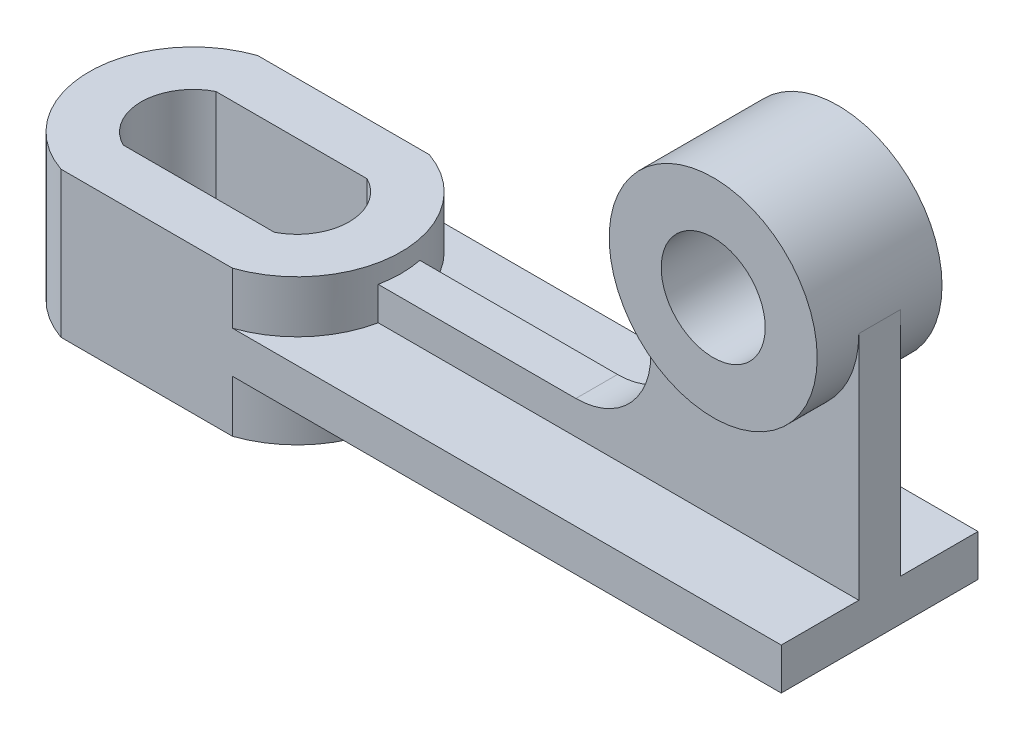
ISO-10303-21;
HEADER;
FILE_DESCRIPTION(('STEP AP214'),'2;1');
FILE_NAME('part.step','',(''),(''),'','','');
FILE_SCHEMA(('AUTOMOTIVE_DESIGN { 1 0 10303 214 1 1 1 1 }'));
ENDSEC;
DATA;
#1=APPLICATION_CONTEXT('core data for automotive mechanical design processes');
#2=APPLICATION_PROTOCOL_DEFINITION('international standard','automotive_design',2000,#1);
#3=PRODUCT_CONTEXT('',#1,'mechanical');
#4=PRODUCT('Part','Part','',(#3));
#5=PRODUCT_RELATED_PRODUCT_CATEGORY('part','',(#4));
#6=PRODUCT_DEFINITION_FORMATION('','',#4);
#7=PRODUCT_DEFINITION_CONTEXT('part definition',#1,'design');
#8=PRODUCT_DEFINITION('design','',#6,#7);
#9=PRODUCT_DEFINITION_SHAPE('','',#8);
#10=(LENGTH_UNIT() NAMED_UNIT(*) SI_UNIT(.MILLI.,.METRE.));
#11=(NAMED_UNIT(*) PLANE_ANGLE_UNIT() SI_UNIT($,.RADIAN.));
#12=(NAMED_UNIT(*) SI_UNIT($,.STERADIAN.) SOLID_ANGLE_UNIT());
#13=UNCERTAINTY_MEASURE_WITH_UNIT(LENGTH_MEASURE(1.E-05),#10,'distance_accuracy_value','');
#14=(GEOMETRIC_REPRESENTATION_CONTEXT(3) GLOBAL_UNCERTAINTY_ASSIGNED_CONTEXT((#13)) GLOBAL_UNIT_ASSIGNED_CONTEXT((#10,
#11,#12)) REPRESENTATION_CONTEXT('',''));
#15=CARTESIAN_POINT('',(0.,0.,0.));
#16=DIRECTION('',(0.,0.,1.));
#17=DIRECTION('',(1.,0.,0.));
#18=AXIS2_PLACEMENT_3D('',#15,#16,#17);
#19=CARTESIAN_POINT('',(152.5,5.,23.6421649826217));
#20=DIRECTION('',(0.,-1.,0.));
#21=DIRECTION('',(0.,0.,-1.));
#22=AXIS2_PLACEMENT_3D('',#19,#20,#21);
#23=PLANE('',#22);
#24=CARTESIAN_POINT('',(12.5,5.,0.));
#25=DIRECTION('',(0.,-1.,0.));
#26=DIRECTION('',(0.,0.,-1.));
#27=AXIS2_PLACEMENT_3D('',#24,#25,#26);
#28=CIRCLE('',#27,25.);
#29=CARTESIAN_POINT('',(20.6269942127762,5.,-23.6421649826217));
#30=VERTEX_POINT('',#29);
#31=CARTESIAN_POINT('',(36.9948974278318,5.,-5.));
#32=VERTEX_POINT('',#31);
#33=EDGE_CURVE('E254',#30,#32,#28,.T.);
#34=ORIENTED_EDGE('',*,*,#33,.T.);
#35=DIRECTION('',(-1.,0.,0.));
#36=VECTOR('',#35,1.);
#37=CARTESIAN_POINT('',(152.5,5.,-5.));
#38=LINE('',#37,#36);
#39=CARTESIAN_POINT('',(152.5,5.,-4.99999999999999));
#40=VERTEX_POINT('',#39);
#41=EDGE_CURVE('E182',#40,#32,#38,.T.);
#42=ORIENTED_EDGE('',*,*,#41,.F.);
#43=DIRECTION('',(0.,0.,1.));
#44=VECTOR('',#43,1.);
#45=CARTESIAN_POINT('',(152.5,5.,23.6421649826217));
#46=LINE('',#45,#44);
#47=CARTESIAN_POINT('',(152.5,5.,-23.6421649826217));
#48=VERTEX_POINT('',#47);
#49=EDGE_CURVE('E224',#48,#40,#46,.T.);
#50=ORIENTED_EDGE('',*,*,#49,.F.);
#51=DIRECTION('',(-1.,0.,0.));
#52=VECTOR('',#51,1.);
#53=CARTESIAN_POINT('',(152.5,5.,-23.6421649826217));
#54=LINE('',#53,#52);
#55=EDGE_CURVE('E246',#48,#30,#54,.T.);
#56=ORIENTED_EDGE('',*,*,#55,.T.);
#57=EDGE_LOOP('',(#34,#42,#50,#56));
#58=FACE_BOUND('',#57,.T.);
#59=ADVANCED_FACE('F38',(#58),#23,.F.);
#60=CARTESIAN_POINT('',(12.5,17.5,0.));
#61=DIRECTION('',(0.,-1.,0.));
#62=DIRECTION('',(0.,0.,-1.));
#63=AXIS2_PLACEMENT_3D('',#60,#61,#62);
#64=CYLINDRICAL_SURFACE('',#63,25.);
#65=CARTESIAN_POINT('',(36.9948974278318,5.,5.));
#66=VERTEX_POINT('',#65);
#67=CARTESIAN_POINT('',(20.6269942127762,5.,23.6421649826217));
#68=VERTEX_POINT('',#67);
#69=EDGE_CURVE('E253',#66,#68,#28,.T.);
#70=ORIENTED_EDGE('',*,*,#69,.F.);
#71=DIRECTION('',(0.,-1.,0.));
#72=VECTOR('',#71,1.);
#73=CARTESIAN_POINT('',(36.9948974278318,17.5,5.));
#74=LINE('',#73,#72);
#75=CARTESIAN_POINT('',(36.9948974278318,13.,5.));
#76=VERTEX_POINT('',#75);
#77=EDGE_CURVE('E367',#66,#76,#74,.F.);
#78=ORIENTED_EDGE('',*,*,#77,.T.);
#79=CARTESIAN_POINT('',(12.5,13.,0.));
#80=DIRECTION('',(0.,-1.,0.));
#81=DIRECTION('',(0.,0.,-1.));
#82=AXIS2_PLACEMENT_3D('',#79,#80,#81);
#83=CIRCLE('',#82,25.);
#84=CARTESIAN_POINT('',(36.9948974278318,13.,-5.));
#85=VERTEX_POINT('',#84);
#86=EDGE_CURVE('E373',#76,#85,#83,.F.);
#87=ORIENTED_EDGE('',*,*,#86,.T.);
#88=DIRECTION('',(0.,-1.,0.));
#89=VECTOR('',#88,1.);
#90=CARTESIAN_POINT('',(36.9948974278318,17.5,-5.));
#91=LINE('',#90,#89);
#92=EDGE_CURVE('E376',#32,#85,#91,.F.);
#93=ORIENTED_EDGE('',*,*,#92,.F.);
#94=ORIENTED_EDGE('',*,*,#33,.F.);
#95=DIRECTION('',(0.,-1.,0.));
#96=VECTOR('',#95,1.);
#97=CARTESIAN_POINT('',(20.6269942127762,17.5,-23.6421649826217));
#98=LINE('',#97,#96);
#99=CARTESIAN_POINT('',(20.6269942127762,17.5,-23.6421649826217));
#100=VERTEX_POINT('',#99);
#101=EDGE_CURVE('E331',#100,#30,#98,.T.);
#102=ORIENTED_EDGE('',*,*,#101,.F.);
#103=CARTESIAN_POINT('',(12.5,17.5,0.));
#104=DIRECTION('',(0.,1.,0.));
#105=DIRECTION('',(0.,0.,-1.));
#106=AXIS2_PLACEMENT_3D('',#103,#104,#105);
#107=CIRCLE('',#106,25.);
#108=CARTESIAN_POINT('',(20.6269942127762,17.5,23.6421649826217));
#109=VERTEX_POINT('',#108);
#110=EDGE_CURVE('E309',#109,#100,#107,.T.);
#111=ORIENTED_EDGE('',*,*,#110,.F.);
#112=DIRECTION('',(0.,-1.,0.));
#113=VECTOR('',#112,1.);
#114=CARTESIAN_POINT('',(20.6269942127762,17.5,23.6421649826217));
#115=LINE('',#114,#113);
#116=EDGE_CURVE('E336',#109,#68,#115,.T.);
#117=ORIENTED_EDGE('',*,*,#116,.T.);
#118=EDGE_LOOP('',(#70,#78,#87,#93,#94,#102,#111,#117));
#119=FACE_BOUND('',#118,.T.);
#120=ADVANCED_FACE('F404',(#119),#64,.T.);
#121=CARTESIAN_POINT('',(12.5,-17.5,0.));
#122=DIRECTION('',(0.,1.,0.));
#123=DIRECTION('',(0.,0.,-1.));
#124=AXIS2_PLACEMENT_3D('',#121,#122,#123);
#125=CIRCLE('',#124,25.);
#126=CARTESIAN_POINT('',(20.6269942127762,-17.5,23.6421649826217));
#127=VERTEX_POINT('',#126);
#128=CARTESIAN_POINT('',(20.6269942127762,-17.5,-23.6421649826217));
#129=VERTEX_POINT('',#128);
#130=EDGE_CURVE('E322',#127,#129,#125,.T.);
#131=ORIENTED_EDGE('',*,*,#130,.T.);
#132=CARTESIAN_POINT('',(20.6269942127762,-5.,-23.6421649826217));
#133=VERTEX_POINT('',#132);
#134=EDGE_CURVE('E330',#133,#129,#98,.T.);
#135=ORIENTED_EDGE('',*,*,#134,.F.);
#136=CARTESIAN_POINT('',(12.5,-5.,0.));
#137=DIRECTION('',(0.,1.,0.));
#138=DIRECTION('',(0.,0.,1.));
#139=AXIS2_PLACEMENT_3D('',#136,#137,#138);
#140=CIRCLE('',#139,25.);
#141=CARTESIAN_POINT('',(20.6269942127762,-5.,23.6421649826217));
#142=VERTEX_POINT('',#141);
#143=EDGE_CURVE('E250',#142,#133,#140,.T.);
#144=ORIENTED_EDGE('',*,*,#143,.F.);
#145=EDGE_CURVE('E335',#142,#127,#115,.T.);
#146=ORIENTED_EDGE('',*,*,#145,.T.);
#147=EDGE_LOOP('',(#131,#135,#144,#146));
#148=FACE_BOUND('',#147,.T.);
#149=ADVANCED_FACE('F411',(#148),#64,.T.);
#150=CARTESIAN_POINT('',(-18.1658767635768,17.5,11.1421649826217));
#151=DIRECTION('',(0.,0.,-1.));
#152=DIRECTION('',(-1.,0.,0.));
#153=AXIS2_PLACEMENT_3D('',#150,#151,#152);
#154=PLANE('',#153);
#155=DIRECTION('',(0.,-1.,0.));
#156=VECTOR('',#155,1.);
#157=CARTESIAN_POINT('',(18.1658767635768,17.5,11.1421649826217));
#158=LINE('',#157,#156);
#159=CARTESIAN_POINT('',(18.1658767635768,17.5,11.1421649826217));
#160=VERTEX_POINT('',#159);
#161=CARTESIAN_POINT('',(18.1658767635768,-17.5,11.1421649826217));
#162=VERTEX_POINT('',#161);
#163=EDGE_CURVE('E293',#160,#162,#158,.T.);
#164=ORIENTED_EDGE('',*,*,#163,.T.);
#165=DIRECTION('',(1.,0.,0.));
#166=VECTOR('',#165,1.);
#167=CARTESIAN_POINT('',(-18.1658767635768,-17.5,11.1421649826217));
#168=LINE('',#167,#166);
#169=CARTESIAN_POINT('',(-18.1658767635768,-17.5,11.1421649826217));
#170=VERTEX_POINT('',#169);
#171=EDGE_CURVE('E276',#170,#162,#168,.T.);
#172=ORIENTED_EDGE('',*,*,#171,.F.);
#173=DIRECTION('',(0.,-1.,0.));
#174=VECTOR('',#173,1.);
#175=CARTESIAN_POINT('',(-18.1658767635768,17.5,11.1421649826217));
#176=LINE('',#175,#174);
#177=CARTESIAN_POINT('',(-18.1658767635768,17.5,11.1421649826217));
#178=VERTEX_POINT('',#177);
#179=EDGE_CURVE('E296',#178,#170,#176,.T.);
#180=ORIENTED_EDGE('',*,*,#179,.F.);
#181=DIRECTION('',(1.,0.,0.));
#182=VECTOR('',#181,1.);
#183=CARTESIAN_POINT('',(-18.1658767635768,17.5,11.1421649826217));
#184=LINE('',#183,#182);
#185=EDGE_CURVE('E262',#178,#160,#184,.T.);
#186=ORIENTED_EDGE('',*,*,#185,.T.);
#187=EDGE_LOOP('',(#164,#172,#180,#186));
#188=FACE_BOUND('',#187,.T.);
#189=ADVANCED_FACE('F463',(#188),#154,.T.);
#190=CARTESIAN_POINT('',(12.5,17.5,0.));
#191=DIRECTION('',(0.,-1.,0.));
#192=DIRECTION('',(0.,0.,-1.));
#193=AXIS2_PLACEMENT_3D('',#190,#191,#192);
#194=CYLINDRICAL_SURFACE('',#193,12.5);
#195=DIRECTION('',(0.,-1.,0.));
#196=VECTOR('',#195,1.);
#197=CARTESIAN_POINT('',(18.1658767635768,17.5,-11.1421649826217));
#198=LINE('',#197,#196);
#199=CARTESIAN_POINT('',(18.1658767635768,17.5,-11.1421649826217));
#200=VERTEX_POINT('',#199);
#201=CARTESIAN_POINT('',(18.1658767635768,-17.5,-11.1421649826217));
#202=VERTEX_POINT('',#201);
#203=EDGE_CURVE('E289',#200,#202,#198,.T.);
#204=ORIENTED_EDGE('',*,*,#203,.T.);
#205=CARTESIAN_POINT('',(12.5,-17.5,0.));
#206=DIRECTION('',(0.,1.,0.));
#207=DIRECTION('',(0.,0.,-1.));
#208=AXIS2_PLACEMENT_3D('',#205,#206,#207);
#209=CIRCLE('',#208,12.5);
#210=EDGE_CURVE('E280',#162,#202,#209,.T.);
#211=ORIENTED_EDGE('',*,*,#210,.F.);
#212=ORIENTED_EDGE('',*,*,#163,.F.);
#213=CARTESIAN_POINT('',(12.5,17.5,0.));
#214=DIRECTION('',(0.,1.,0.));
#215=DIRECTION('',(0.,0.,-1.));
#216=AXIS2_PLACEMENT_3D('',#213,#214,#215);
#217=CIRCLE('',#216,12.5);
#218=EDGE_CURVE('E266',#160,#200,#217,.T.);
#219=ORIENTED_EDGE('',*,*,#218,.T.);
#220=EDGE_LOOP('',(#204,#211,#212,#219));
#221=FACE_BOUND('',#220,.T.);
#222=ADVANCED_FACE('F467',(#221),#194,.F.);
#223=CARTESIAN_POINT('',(-18.1658767635768,17.5,-11.1421649826217));
#224=DIRECTION('',(0.,0.,1.));
#225=DIRECTION('',(1.,0.,0.));
#226=AXIS2_PLACEMENT_3D('',#223,#224,#225);
#227=PLANE('',#226);
#228=DIRECTION('',(-1.,0.,0.));
#229=VECTOR('',#228,1.);
#230=CARTESIAN_POINT('',(-18.1658767635768,-17.5,-11.1421649826217));
#231=LINE('',#230,#229);
#232=CARTESIAN_POINT('',(-18.1658767635768,-17.5,-11.1421649826217));
#233=VERTEX_POINT('',#232);
#234=EDGE_CURVE('E263',#202,#233,#231,.T.);
#235=ORIENTED_EDGE('',*,*,#234,.F.);
#236=ORIENTED_EDGE('',*,*,#203,.F.);
#237=DIRECTION('',(-1.,0.,0.));
#238=VECTOR('',#237,1.);
#239=CARTESIAN_POINT('',(-18.1658767635768,17.5,-11.1421649826217));
#240=LINE('',#239,#238);
#241=CARTESIAN_POINT('',(-18.1658767635768,17.5,-11.1421649826217));
#242=VERTEX_POINT('',#241);
#243=EDGE_CURVE('E270',#200,#242,#240,.T.);
#244=ORIENTED_EDGE('',*,*,#243,.T.);
#245=DIRECTION('',(0.,-1.,0.));
#246=VECTOR('',#245,1.);
#247=CARTESIAN_POINT('',(-18.1658767635768,17.5,-11.1421649826217));
#248=LINE('',#247,#246);
#249=EDGE_CURVE('E273',#242,#233,#248,.T.);
#250=ORIENTED_EDGE('',*,*,#249,.T.);
#251=EDGE_LOOP('',(#235,#236,#244,#250));
#252=FACE_BOUND('',#251,.T.);
#253=ADVANCED_FACE('F482',(#252),#227,.T.);
#254=CARTESIAN_POINT('',(-12.5,17.5,0.));
#255=DIRECTION('',(0.,1.,0.));
#256=DIRECTION('',(0.,0.,1.));
#257=AXIS2_PLACEMENT_3D('',#254,#255,#256);
#258=PLANE('',#257);
#259=CARTESIAN_POINT('',(-12.5,17.5,0.));
#260=DIRECTION('',(0.,1.,0.));
#261=DIRECTION('',(0.,0.,1.));
#262=AXIS2_PLACEMENT_3D('',#259,#260,#261);
#263=CIRCLE('',#262,25.);
#264=CARTESIAN_POINT('',(-20.6269942127762,17.5,-23.6421649826217));
#265=VERTEX_POINT('',#264);
#266=CARTESIAN_POINT('',(-20.6269942127762,17.5,23.6421649826217));
#267=VERTEX_POINT('',#266);
#268=EDGE_CURVE('E301',#265,#267,#263,.T.);
#269=ORIENTED_EDGE('',*,*,#268,.T.);
#270=DIRECTION('',(1.,0.,0.));
#271=VECTOR('',#270,1.);
#272=CARTESIAN_POINT('',(-20.6269942127762,17.5,23.6421649826217));
#273=LINE('',#272,#271);
#274=EDGE_CURVE('E305',#267,#109,#273,.T.);
#275=ORIENTED_EDGE('',*,*,#274,.T.);
#276=ORIENTED_EDGE('',*,*,#110,.T.);
#277=DIRECTION('',(-1.,0.,0.));
#278=VECTOR('',#277,1.);
#279=CARTESIAN_POINT('',(-20.6269942127762,17.5,-23.6421649826217));
#280=LINE('',#279,#278);
#281=EDGE_CURVE('E312',#100,#265,#280,.T.);
#282=ORIENTED_EDGE('',*,*,#281,.T.);
#283=EDGE_LOOP('',(#269,#275,#276,#282));
#284=FACE_BOUND('',#283,.T.);
#285=ORIENTED_EDGE('',*,*,#185,.F.);
#286=CARTESIAN_POINT('',(-12.5,17.5,0.));
#287=DIRECTION('',(0.,1.,0.));
#288=DIRECTION('',(0.,0.,1.));
#289=AXIS2_PLACEMENT_3D('',#286,#287,#288);
#290=CIRCLE('',#289,12.5);
#291=EDGE_CURVE('E259',#242,#178,#290,.T.);
#292=ORIENTED_EDGE('',*,*,#291,.F.);
#293=ORIENTED_EDGE('',*,*,#243,.F.);
#294=ORIENTED_EDGE('',*,*,#218,.F.);
#295=EDGE_LOOP('',(#285,#292,#293,#294));
#296=FACE_BOUND('',#295,.T.);
#297=ADVANCED_FACE('F449',(#284,#296),#258,.T.);
#298=CARTESIAN_POINT('',(-12.5,-17.5,0.));
#299=DIRECTION('',(0.,1.,0.));
#300=DIRECTION('',(0.,0.,1.));
#301=AXIS2_PLACEMENT_3D('',#298,#299,#300);
#302=PLANE('',#301);
#303=CARTESIAN_POINT('',(-12.5,-17.5,0.));
#304=DIRECTION('',(0.,1.,0.));
#305=DIRECTION('',(0.,0.,1.));
#306=AXIS2_PLACEMENT_3D('',#303,#304,#305);
#307=CIRCLE('',#306,12.5);
#308=EDGE_CURVE('E258',#233,#170,#307,.T.);
#309=ORIENTED_EDGE('',*,*,#308,.T.);
#310=ORIENTED_EDGE('',*,*,#171,.T.);
#311=ORIENTED_EDGE('',*,*,#210,.T.);
#312=ORIENTED_EDGE('',*,*,#234,.T.);
#313=EDGE_LOOP('',(#309,#310,#311,#312));
#314=FACE_BOUND('',#313,.T.);
#315=DIRECTION('',(1.,0.,0.));
#316=VECTOR('',#315,1.);
#317=CARTESIAN_POINT('',(-20.6269942127762,-17.5,23.6421649826217));
#318=LINE('',#317,#316);
#319=CARTESIAN_POINT('',(-20.6269942127762,-17.5,23.6421649826217));
#320=VERTEX_POINT('',#319);
#321=EDGE_CURVE('E318',#320,#127,#318,.T.);
#322=ORIENTED_EDGE('',*,*,#321,.F.);
#323=CARTESIAN_POINT('',(-12.5,-17.5,0.));
#324=DIRECTION('',(0.,1.,0.));
#325=DIRECTION('',(0.,0.,1.));
#326=AXIS2_PLACEMENT_3D('',#323,#324,#325);
#327=CIRCLE('',#326,25.);
#328=CARTESIAN_POINT('',(-20.6269942127762,-17.5,-23.6421649826217));
#329=VERTEX_POINT('',#328);
#330=EDGE_CURVE('E300',#329,#320,#327,.T.);
#331=ORIENTED_EDGE('',*,*,#330,.F.);
#332=DIRECTION('',(-1.,0.,0.));
#333=VECTOR('',#332,1.);
#334=CARTESIAN_POINT('',(-20.6269942127762,-17.5,-23.6421649826217));
#335=LINE('',#334,#333);
#336=EDGE_CURVE('E306',#129,#329,#335,.T.);
#337=ORIENTED_EDGE('',*,*,#336,.F.);
#338=ORIENTED_EDGE('',*,*,#130,.F.);
#339=EDGE_LOOP('',(#322,#331,#337,#338));
#340=FACE_BOUND('',#339,.T.);
#341=ADVANCED_FACE('F459',(#314,#340),#302,.F.);
#342=CARTESIAN_POINT('',(-12.5,17.5,0.));
#343=DIRECTION('',(0.,-1.,0.));
#344=DIRECTION('',(0.,0.,-1.));
#345=AXIS2_PLACEMENT_3D('',#342,#343,#344);
#346=CYLINDRICAL_SURFACE('',#345,25.);
#347=ORIENTED_EDGE('',*,*,#330,.T.);
#348=DIRECTION('',(0.,-1.,0.));
#349=VECTOR('',#348,1.);
#350=CARTESIAN_POINT('',(-20.6269942127762,17.5,23.6421649826217));
#351=LINE('',#350,#349);
#352=EDGE_CURVE('E340',#267,#320,#351,.T.);
#353=ORIENTED_EDGE('',*,*,#352,.F.);
#354=ORIENTED_EDGE('',*,*,#268,.F.);
#355=DIRECTION('',(0.,-1.,0.));
#356=VECTOR('',#355,1.);
#357=CARTESIAN_POINT('',(-20.6269942127762,17.5,-23.6421649826217));
#358=LINE('',#357,#356);
#359=EDGE_CURVE('E315',#265,#329,#358,.T.);
#360=ORIENTED_EDGE('',*,*,#359,.T.);
#361=EDGE_LOOP('',(#347,#353,#354,#360));
#362=FACE_BOUND('',#361,.T.);
#363=ADVANCED_FACE('F455',(#362),#346,.T.);
#364=CARTESIAN_POINT('',(-20.6269942127762,17.5,23.6421649826217));
#365=DIRECTION('',(0.,0.,-1.));
#366=DIRECTION('',(-1.,0.,0.));
#367=AXIS2_PLACEMENT_3D('',#364,#365,#366);
#368=PLANE('',#367);
#369=ORIENTED_EDGE('',*,*,#145,.F.);
#370=DIRECTION('',(-1.,0.,0.));
#371=VECTOR('',#370,1.);
#372=CARTESIAN_POINT('',(152.5,-5.,23.6421649826217));
#373=LINE('',#372,#371);
#374=CARTESIAN_POINT('',(152.5,-5.,23.6421649826217));
#375=VERTEX_POINT('',#374);
#376=EDGE_CURVE('E238',#375,#142,#373,.T.);
#377=ORIENTED_EDGE('',*,*,#376,.F.);
#378=DIRECTION('',(0.,-1.,0.));
#379=VECTOR('',#378,1.);
#380=CARTESIAN_POINT('',(152.5,5.,23.6421649826217));
#381=LINE('',#380,#379);
#382=CARTESIAN_POINT('',(152.5,5.,23.6421649826217));
#383=VERTEX_POINT('',#382);
#384=EDGE_CURVE('E228',#383,#375,#381,.T.);
#385=ORIENTED_EDGE('',*,*,#384,.F.);
#386=DIRECTION('',(-1.,0.,0.));
#387=VECTOR('',#386,1.);
#388=CARTESIAN_POINT('',(152.5,5.,23.6421649826217));
#389=LINE('',#388,#387);
#390=EDGE_CURVE('E242',#383,#68,#389,.T.);
#391=ORIENTED_EDGE('',*,*,#390,.T.);
#392=ORIENTED_EDGE('',*,*,#116,.F.);
#393=ORIENTED_EDGE('',*,*,#274,.F.);
#394=ORIENTED_EDGE('',*,*,#352,.T.);
#395=ORIENTED_EDGE('',*,*,#321,.T.);
#396=EDGE_LOOP('',(#369,#377,#385,#391,#392,#393,#394,#395));
#397=FACE_BOUND('',#396,.T.);
#398=ADVANCED_FACE('F436',(#397),#368,.F.);
#399=CARTESIAN_POINT('',(-20.6269942127762,17.5,-23.6421649826217));
#400=DIRECTION('',(0.,0.,1.));
#401=DIRECTION('',(1.,0.,0.));
#402=AXIS2_PLACEMENT_3D('',#399,#400,#401);
#403=PLANE('',#402);
#404=ORIENTED_EDGE('',*,*,#101,.T.);
#405=ORIENTED_EDGE('',*,*,#55,.F.);
#406=DIRECTION('',(0.,1.,0.));
#407=VECTOR('',#406,1.);
#408=CARTESIAN_POINT('',(152.5,5.,-23.6421649826217));
#409=LINE('',#408,#407);
#410=CARTESIAN_POINT('',(152.5,-5.,-23.6421649826217));
#411=VERTEX_POINT('',#410);
#412=EDGE_CURVE('E219',#411,#48,#409,.T.);
#413=ORIENTED_EDGE('',*,*,#412,.F.);
#414=DIRECTION('',(-1.,0.,0.));
#415=VECTOR('',#414,1.);
#416=CARTESIAN_POINT('',(152.5,-5.,-23.6421649826217));
#417=LINE('',#416,#415);
#418=EDGE_CURVE('E234',#411,#133,#417,.T.);
#419=ORIENTED_EDGE('',*,*,#418,.T.);
#420=ORIENTED_EDGE('',*,*,#134,.T.);
#421=ORIENTED_EDGE('',*,*,#336,.T.);
#422=ORIENTED_EDGE('',*,*,#359,.F.);
#423=ORIENTED_EDGE('',*,*,#281,.F.);
#424=EDGE_LOOP('',(#404,#405,#413,#419,#420,#421,#422,#423));
#425=FACE_BOUND('',#424,.T.);
#426=ADVANCED_FACE('F425',(#425),#403,.F.);
#427=CARTESIAN_POINT('',(-12.5,17.5,0.));
#428=DIRECTION('',(0.,-1.,0.));
#429=DIRECTION('',(0.,0.,-1.));
#430=AXIS2_PLACEMENT_3D('',#427,#428,#429);
#431=CYLINDRICAL_SURFACE('',#430,12.5);
#432=ORIENTED_EDGE('',*,*,#179,.T.);
#433=ORIENTED_EDGE('',*,*,#308,.F.);
#434=ORIENTED_EDGE('',*,*,#249,.F.);
#435=ORIENTED_EDGE('',*,*,#291,.T.);
#436=EDGE_LOOP('',(#432,#433,#434,#435));
#437=FACE_BOUND('',#436,.T.);
#438=ADVANCED_FACE('F418',(#437),#431,.F.);
#439=DIRECTION('',(-1.,0.,0.));
#440=VECTOR('',#439,1.);
#441=CARTESIAN_POINT('',(152.5,5.,5.));
#442=LINE('',#441,#440);
#443=CARTESIAN_POINT('',(152.5,5.,5.));
#444=VERTEX_POINT('',#443);
#445=EDGE_CURVE('E216',#444,#66,#442,.T.);
#446=ORIENTED_EDGE('',*,*,#445,.T.);
#447=ORIENTED_EDGE('',*,*,#69,.T.);
#448=ORIENTED_EDGE('',*,*,#390,.F.);
#449=EDGE_CURVE('E223',#444,#383,#46,.T.);
#450=ORIENTED_EDGE('',*,*,#449,.F.);
#451=EDGE_LOOP('',(#446,#447,#448,#450));
#452=FACE_BOUND('',#451,.T.);
#453=ADVANCED_FACE('F407',(#452),#23,.F.);
#454=CARTESIAN_POINT('',(152.5,-5.,23.6421649826217));
#455=DIRECTION('',(0.,1.,0.));
#456=DIRECTION('',(0.,0.,1.));
#457=AXIS2_PLACEMENT_3D('',#454,#455,#456);
#458=PLANE('',#457);
#459=ORIENTED_EDGE('',*,*,#143,.T.);
#460=ORIENTED_EDGE('',*,*,#418,.F.);
#461=DIRECTION('',(0.,0.,-1.));
#462=VECTOR('',#461,1.);
#463=CARTESIAN_POINT('',(152.5,-5.,23.6421649826217));
#464=LINE('',#463,#462);
#465=EDGE_CURVE('E231',#375,#411,#464,.T.);
#466=ORIENTED_EDGE('',*,*,#465,.F.);
#467=ORIENTED_EDGE('',*,*,#376,.T.);
#468=EDGE_LOOP('',(#459,#460,#466,#467));
#469=FACE_BOUND('',#468,.T.);
#470=ADVANCED_FACE('F417',(#469),#458,.F.);
#471=CARTESIAN_POINT('',(152.5,0.,0.));
#472=DIRECTION('',(1.,0.,0.));
#473=DIRECTION('',(0.,0.,-1.));
#474=AXIS2_PLACEMENT_3D('',#471,#472,#473);
#475=PLANE('',#474);
#476=ORIENTED_EDGE('',*,*,#465,.T.);
#477=ORIENTED_EDGE('',*,*,#412,.T.);
#478=ORIENTED_EDGE('',*,*,#49,.T.);
#479=DIRECTION('',(0.,1.,0.));
#480=VECTOR('',#479,1.);
#481=CARTESIAN_POINT('',(152.5,0.,-5.));
#482=LINE('',#481,#480);
#483=CARTESIAN_POINT('',(152.5,60.5,-5.));
#484=VERTEX_POINT('',#483);
#485=EDGE_CURVE('E193',#40,#484,#482,.T.);
#486=ORIENTED_EDGE('',*,*,#485,.T.);
#487=DIRECTION('',(0.,0.,-1.));
#488=VECTOR('',#487,1.);
#489=CARTESIAN_POINT('',(152.5,60.5,5.));
#490=LINE('',#489,#488);
#491=CARTESIAN_POINT('',(152.5,60.5,5.));
#492=VERTEX_POINT('',#491);
#493=EDGE_CURVE('E183',#492,#484,#490,.T.);
#494=ORIENTED_EDGE('',*,*,#493,.F.);
#495=DIRECTION('',(0.,1.,0.));
#496=VECTOR('',#495,1.);
#497=CARTESIAN_POINT('',(152.5,0.,5.));
#498=LINE('',#497,#496);
#499=EDGE_CURVE('E206',#444,#492,#498,.T.);
#500=ORIENTED_EDGE('',*,*,#499,.F.);
#501=ORIENTED_EDGE('',*,*,#449,.T.);
#502=ORIENTED_EDGE('',*,*,#384,.T.);
#503=EDGE_LOOP('',(#476,#477,#478,#486,#494,#500,#501,#502));
#504=FACE_BOUND('',#503,.T.);
#505=ADVANCED_FACE('F400',(#504),#475,.T.);
#506=CARTESIAN_POINT('',(102.5,60.5,5.));
#507=DIRECTION('',(1.,0.,0.));
#508=DIRECTION('',(0.,0.,-1.));
#509=AXIS2_PLACEMENT_3D('',#506,#507,#508);
#510=PLANE('',#509);
#511=DIRECTION('',(0.,-1.,0.));
#512=VECTOR('',#511,1.);
#513=CARTESIAN_POINT('',(102.5,60.5,-5.));
#514=LINE('',#513,#512);
#515=CARTESIAN_POINT('',(102.5,60.5,-5.));
#516=VERTEX_POINT('',#515);
#517=CARTESIAN_POINT('',(102.5,31.,-5.));
#518=VERTEX_POINT('',#517);
#519=EDGE_CURVE('E174',#516,#518,#514,.T.);
#520=ORIENTED_EDGE('',*,*,#519,.T.);
#521=DIRECTION('',(0.,0.,-1.));
#522=VECTOR('',#521,1.);
#523=CARTESIAN_POINT('',(102.5,31.,5.));
#524=LINE('',#523,#522);
#525=CARTESIAN_POINT('',(102.5,31.,5.));
#526=VERTEX_POINT('',#525);
#527=EDGE_CURVE('E344',#518,#526,#524,.F.);
#528=ORIENTED_EDGE('',*,*,#527,.T.);
#529=DIRECTION('',(0.,-1.,0.));
#530=VECTOR('',#529,1.);
#531=CARTESIAN_POINT('',(102.5,60.5,5.));
#532=LINE('',#531,#530);
#533=CARTESIAN_POINT('',(102.5,60.5,5.));
#534=VERTEX_POINT('',#533);
#535=EDGE_CURVE('E176',#534,#526,#532,.T.);
#536=ORIENTED_EDGE('',*,*,#535,.F.);
#537=DIRECTION('',(0.,0.,-1.));
#538=VECTOR('',#537,1.);
#539=CARTESIAN_POINT('',(102.5,60.5,5.));
#540=LINE('',#539,#538);
#541=EDGE_CURVE('E170',#534,#516,#540,.T.);
#542=ORIENTED_EDGE('',*,*,#541,.T.);
#543=EDGE_LOOP('',(#520,#528,#536,#542));
#544=FACE_BOUND('',#543,.T.);
#545=ADVANCED_FACE('F172',(#544),#510,.F.);
#546=CARTESIAN_POINT('',(127.5,60.5,5.));
#547=DIRECTION('',(0.,0.,1.));
#548=DIRECTION('',(1.,0.,0.));
#549=AXIS2_PLACEMENT_3D('',#546,#547,#548);
#550=PLANE('',#549);
#551=ORIENTED_EDGE('',*,*,#499,.T.);
#552=CARTESIAN_POINT('',(127.5,60.5,5.));
#553=DIRECTION('',(0.,0.,-1.));
#554=DIRECTION('',(1.,0.,0.));
#555=AXIS2_PLACEMENT_3D('',#552,#553,#554);
#556=CIRCLE('',#555,25.);
#557=EDGE_CURVE('E211',#492,#534,#556,.T.);
#558=ORIENTED_EDGE('',*,*,#557,.T.);
#559=ORIENTED_EDGE('',*,*,#535,.T.);
#560=CARTESIAN_POINT('',(84.5,31.,5.));
#561=DIRECTION('',(0.,0.,1.));
#562=DIRECTION('',(1.,0.,0.));
#563=AXIS2_PLACEMENT_3D('',#560,#561,#562);
#564=CIRCLE('',#563,18.);
#565=CARTESIAN_POINT('',(84.5,13.,5.));
#566=VERTEX_POINT('',#565);
#567=EDGE_CURVE('E47',#526,#566,#564,.F.);
#568=ORIENTED_EDGE('',*,*,#567,.T.);
#569=DIRECTION('',(1.,0.,0.));
#570=VECTOR('',#569,1.);
#571=CARTESIAN_POINT('',(57.5,13.,5.));
#572=LINE('',#571,#570);
#573=EDGE_CURVE('E380',#76,#566,#572,.T.);
#574=ORIENTED_EDGE('',*,*,#573,.F.);
#575=ORIENTED_EDGE('',*,*,#77,.F.);
#576=ORIENTED_EDGE('',*,*,#445,.F.);
#577=EDGE_LOOP('',(#551,#558,#559,#568,#574,#575,#576));
#578=FACE_BOUND('',#577,.T.);
#579=ADVANCED_FACE('F389',(#578),#550,.T.);
#580=CARTESIAN_POINT('',(127.5,60.5,-5.));
#581=DIRECTION('',(0.,0.,1.));
#582=DIRECTION('',(1.,0.,0.));
#583=AXIS2_PLACEMENT_3D('',#580,#581,#582);
#584=PLANE('',#583);
#585=ORIENTED_EDGE('',*,*,#41,.T.);
#586=ORIENTED_EDGE('',*,*,#92,.T.);
#587=DIRECTION('',(1.,0.,0.));
#588=VECTOR('',#587,1.);
#589=CARTESIAN_POINT('',(57.5,13.,-5.));
#590=LINE('',#589,#588);
#591=CARTESIAN_POINT('',(84.5,13.,-5.));
#592=VERTEX_POINT('',#591);
#593=EDGE_CURVE('E381',#85,#592,#590,.T.);
#594=ORIENTED_EDGE('',*,*,#593,.T.);
#595=CARTESIAN_POINT('',(84.5,31.,-5.));
#596=DIRECTION('',(0.,0.,1.));
#597=DIRECTION('',(1.,0.,0.));
#598=AXIS2_PLACEMENT_3D('',#595,#596,#597);
#599=CIRCLE('',#598,18.);
#600=EDGE_CURVE('E11',#592,#518,#599,.T.);
#601=ORIENTED_EDGE('',*,*,#600,.T.);
#602=ORIENTED_EDGE('',*,*,#519,.F.);
#603=CARTESIAN_POINT('',(127.5,60.5,-5.));
#604=DIRECTION('',(0.,0.,-1.));
#605=DIRECTION('',(1.,0.,0.));
#606=AXIS2_PLACEMENT_3D('',#603,#604,#605);
#607=CIRCLE('',#606,25.);
#608=EDGE_CURVE('E189',#484,#516,#607,.T.);
#609=ORIENTED_EDGE('',*,*,#608,.F.);
#610=ORIENTED_EDGE('',*,*,#485,.F.);
#611=EDGE_LOOP('',(#585,#586,#594,#601,#602,#609,#610));
#612=FACE_BOUND('',#611,.T.);
#613=ADVANCED_FACE('F187',(#612),#584,.F.);
#614=CARTESIAN_POINT('',(127.5,60.5,15.));
#615=DIRECTION('',(0.,0.,1.));
#616=DIRECTION('',(1.,0.,0.));
#617=AXIS2_PLACEMENT_3D('',#614,#615,#616);
#618=PLANE('',#617);
#619=CARTESIAN_POINT('',(127.5,60.5,15.));
#620=DIRECTION('',(0.,0.,1.));
#621=DIRECTION('',(1.,0.,0.));
#622=AXIS2_PLACEMENT_3D('',#619,#620,#621);
#623=CIRCLE('',#622,25.);
#624=CARTESIAN_POINT('',(152.5,60.5,15.));
#625=VERTEX_POINT('',#624);
#626=EDGE_CURVE('E199',#625,#625,#623,.T.);
#627=ORIENTED_EDGE('',*,*,#626,.T.);
#628=EDGE_LOOP('',(#627));
#629=FACE_BOUND('',#628,.T.);
#630=CARTESIAN_POINT('',(127.5,60.5,15.));
#631=DIRECTION('',(0.,0.,1.));
#632=DIRECTION('',(1.,0.,0.));
#633=AXIS2_PLACEMENT_3D('',#630,#631,#632);
#634=CIRCLE('',#633,12.5);
#635=CARTESIAN_POINT('',(140.,60.5,15.));
#636=VERTEX_POINT('',#635);
#637=EDGE_CURVE('E361',#636,#636,#634,.T.);
#638=ORIENTED_EDGE('',*,*,#637,.F.);
#639=EDGE_LOOP('',(#638));
#640=FACE_BOUND('',#639,.T.);
#641=ADVANCED_FACE('F398',(#629,#640),#618,.T.);
#642=CARTESIAN_POINT('',(127.5,60.5,-15.));
#643=DIRECTION('',(0.,0.,1.));
#644=DIRECTION('',(1.,0.,0.));
#645=AXIS2_PLACEMENT_3D('',#642,#643,#644);
#646=PLANE('',#645);
#647=CARTESIAN_POINT('',(127.5,60.5,-15.));
#648=DIRECTION('',(0.,0.,1.));
#649=DIRECTION('',(1.,0.,0.));
#650=AXIS2_PLACEMENT_3D('',#647,#648,#649);
#651=CIRCLE('',#650,25.);
#652=CARTESIAN_POINT('',(152.5,60.5,-15.));
#653=VERTEX_POINT('',#652);
#654=EDGE_CURVE('E203',#653,#653,#651,.T.);
#655=ORIENTED_EDGE('',*,*,#654,.F.);
#656=EDGE_LOOP('',(#655));
#657=FACE_BOUND('',#656,.T.);
#658=CARTESIAN_POINT('',(127.5,60.5,-15.));
#659=DIRECTION('',(0.,0.,1.));
#660=DIRECTION('',(1.,0.,0.));
#661=AXIS2_PLACEMENT_3D('',#658,#659,#660);
#662=CIRCLE('',#661,12.5);
#663=CARTESIAN_POINT('',(140.,60.5,-15.));
#664=VERTEX_POINT('',#663);
#665=EDGE_CURVE('E363',#664,#664,#662,.T.);
#666=ORIENTED_EDGE('',*,*,#665,.T.);
#667=EDGE_LOOP('',(#666));
#668=FACE_BOUND('',#667,.T.);
#669=ADVANCED_FACE('F563',(#657,#668),#646,.F.);
#670=CARTESIAN_POINT('',(127.5,60.5,15.));
#671=DIRECTION('',(0.,0.,-1.));
#672=DIRECTION('',(-1.,0.,0.));
#673=AXIS2_PLACEMENT_3D('',#670,#671,#672);
#674=CYLINDRICAL_SURFACE('',#673,25.);
#675=ORIENTED_EDGE('',*,*,#557,.F.);
#676=ORIENTED_EDGE('',*,*,#493,.T.);
#677=ORIENTED_EDGE('',*,*,#608,.T.);
#678=ORIENTED_EDGE('',*,*,#541,.F.);
#679=EDGE_LOOP('',(#675,#676,#677,#678));
#680=FACE_BOUND('',#679,.T.);
#681=ORIENTED_EDGE('',*,*,#626,.F.);
#682=EDGE_LOOP('',(#681));
#683=FACE_BOUND('',#682,.T.);
#684=ORIENTED_EDGE('',*,*,#654,.T.);
#685=EDGE_LOOP('',(#684));
#686=FACE_BOUND('',#685,.T.);
#687=ADVANCED_FACE('F195',(#680,#683,#686),#674,.T.);
#688=CARTESIAN_POINT('',(127.5,60.5,15.));
#689=DIRECTION('',(0.,0.,-1.));
#690=DIRECTION('',(-1.,0.,0.));
#691=AXIS2_PLACEMENT_3D('',#688,#689,#690);
#692=CYLINDRICAL_SURFACE('',#691,12.5);
#693=ORIENTED_EDGE('',*,*,#637,.T.);
#694=EDGE_LOOP('',(#693));
#695=FACE_BOUND('',#694,.T.);
#696=ORIENTED_EDGE('',*,*,#665,.F.);
#697=EDGE_LOOP('',(#696));
#698=FACE_BOUND('',#697,.T.);
#699=ADVANCED_FACE('F580',(#695,#698),#692,.F.);
#700=CARTESIAN_POINT('',(37.5,13.,0.));
#701=DIRECTION('',(0.,-1.,0.));
#702=DIRECTION('',(1.,0.,0.));
#703=AXIS2_PLACEMENT_3D('',#700,#701,#702);
#704=PLANE('',#703);
#705=ORIENTED_EDGE('',*,*,#573,.T.);
#706=DIRECTION('',(0.,0.,1.));
#707=VECTOR('',#706,1.);
#708=CARTESIAN_POINT('',(84.5,13.,0.));
#709=LINE('',#708,#707);
#710=EDGE_CURVE('E54',#566,#592,#709,.F.);
#711=ORIENTED_EDGE('',*,*,#710,.T.);
#712=ORIENTED_EDGE('',*,*,#593,.F.);
#713=ORIENTED_EDGE('',*,*,#86,.F.);
#714=EDGE_LOOP('',(#705,#711,#712,#713));
#715=FACE_BOUND('',#714,.T.);
#716=ADVANCED_FACE('F386',(#715),#704,.F.);
#717=CARTESIAN_POINT('',(84.5,31.,5.));
#718=DIRECTION('',(0.,0.,-1.));
#719=DIRECTION('',(-1.,0.,0.));
#720=AXIS2_PLACEMENT_3D('',#717,#718,#719);
#721=CYLINDRICAL_SURFACE('',#720,18.);
#722=ORIENTED_EDGE('',*,*,#600,.F.);
#723=ORIENTED_EDGE('',*,*,#710,.F.);
#724=ORIENTED_EDGE('',*,*,#567,.F.);
#725=ORIENTED_EDGE('',*,*,#527,.F.);
#726=EDGE_LOOP('',(#722,#723,#724,#725));
#727=FACE_BOUND('',#726,.T.);
#728=ADVANCED_FACE('F40',(#727),#721,.F.);
#729=CLOSED_SHELL('',(#59,#120,#149,#189,#222,#253,#297,#341,#363,#398,#426,#438,#453,#470,#505,
#545,#579,#613,#641,#669,#687,#699,#716,#728));
#730=MANIFOLD_SOLID_BREP('B2',#729);
#731=ADVANCED_BREP_SHAPE_REPRESENTATION('',(#18,#730),#14);
#732=SHAPE_DEFINITION_REPRESENTATION(#9,#731);
ENDSEC;
END-ISO-10303-21;
